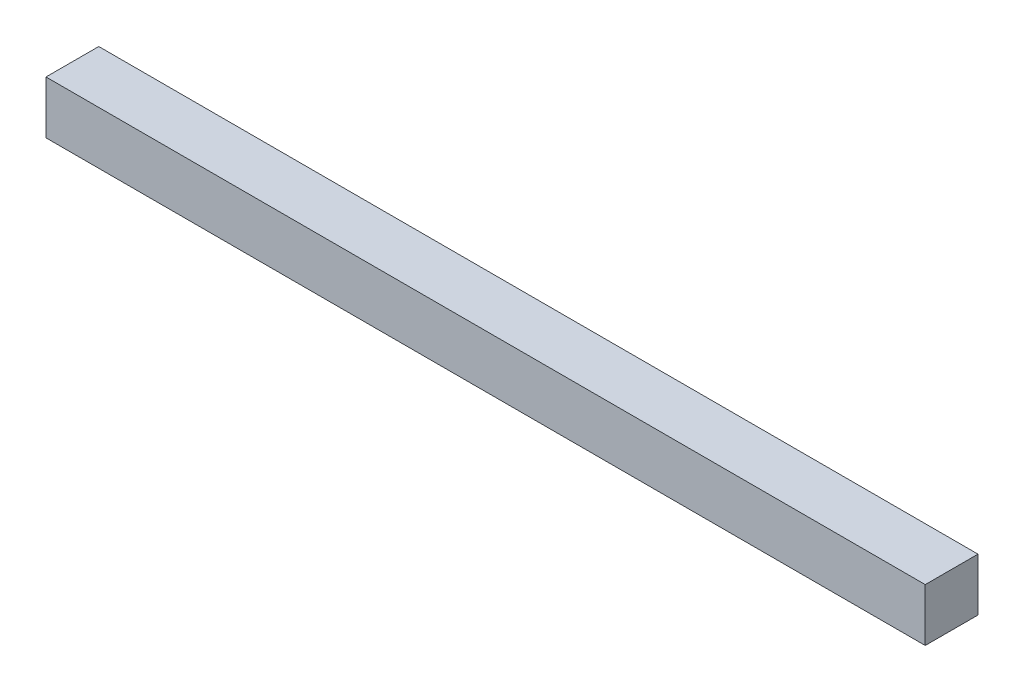
ISO-10303-21;
HEADER;
FILE_DESCRIPTION(('STEP AP214'),'2;1');
FILE_NAME('part.step','',(''),(''),'','','');
FILE_SCHEMA(('AUTOMOTIVE_DESIGN { 1 0 10303 214 1 1 1 1 }'));
ENDSEC;
DATA;
#1=APPLICATION_CONTEXT('core data for automotive mechanical design processes');
#2=APPLICATION_PROTOCOL_DEFINITION('international standard','automotive_design',2000,#1);
#3=PRODUCT_CONTEXT('',#1,'mechanical');
#4=PRODUCT('Part','Part','',(#3));
#5=PRODUCT_RELATED_PRODUCT_CATEGORY('part','',(#4));
#6=PRODUCT_DEFINITION_FORMATION('','',#4);
#7=PRODUCT_DEFINITION_CONTEXT('part definition',#1,'design');
#8=PRODUCT_DEFINITION('design','',#6,#7);
#9=PRODUCT_DEFINITION_SHAPE('','',#8);
#10=(LENGTH_UNIT() NAMED_UNIT(*) SI_UNIT(.MILLI.,.METRE.));
#11=(NAMED_UNIT(*) PLANE_ANGLE_UNIT() SI_UNIT($,.RADIAN.));
#12=(NAMED_UNIT(*) SI_UNIT($,.STERADIAN.) SOLID_ANGLE_UNIT());
#13=UNCERTAINTY_MEASURE_WITH_UNIT(LENGTH_MEASURE(1.E-05),#10,'distance_accuracy_value','');
#14=(GEOMETRIC_REPRESENTATION_CONTEXT(3) GLOBAL_UNCERTAINTY_ASSIGNED_CONTEXT((#13)) GLOBAL_UNIT_ASSIGNED_CONTEXT((#10,
#11,#12)) REPRESENTATION_CONTEXT('',''));
#15=CARTESIAN_POINT('',(0.,0.,0.));
#16=DIRECTION('',(0.,0.,1.));
#17=DIRECTION('',(1.,0.,0.));
#18=AXIS2_PLACEMENT_3D('',#15,#16,#17);
#19=CARTESIAN_POINT('',(500.,21.9634752981268,-20.3959114139693));
#20=DIRECTION('',(0.,0.,1.));
#21=DIRECTION('',(0.,-1.,0.));
#22=AXIS2_PLACEMENT_3D('',#19,#20,#21);
#23=PLANE('',#22);
#24=DIRECTION('',(0.,1.,0.));
#25=VECTOR('',#24,1.);
#26=CARTESIAN_POINT('',(0.,21.9634752981268,-20.3959114139693));
#27=LINE('',#26,#25);
#28=CARTESIAN_POINT('',(0.,-8.03652470187323,-20.3959114139693));
#29=VERTEX_POINT('',#28);
#30=CARTESIAN_POINT('',(0.,21.9634752981268,-20.3959114139693));
#31=VERTEX_POINT('',#30);
#32=EDGE_CURVE('E95',#29,#31,#27,.T.);
#33=ORIENTED_EDGE('',*,*,#32,.T.);
#34=DIRECTION('',(-1.,0.,0.));
#35=VECTOR('',#34,1.);
#36=CARTESIAN_POINT('',(500.,21.9634752981268,-20.3959114139693));
#37=LINE('',#36,#35);
#38=CARTESIAN_POINT('',(500.,21.9634752981268,-20.3959114139693));
#39=VERTEX_POINT('',#38);
#40=EDGE_CURVE('E11',#39,#31,#37,.T.);
#41=ORIENTED_EDGE('',*,*,#40,.F.);
#42=DIRECTION('',(0.,1.,0.));
#43=VECTOR('',#42,1.);
#44=CARTESIAN_POINT('',(500.,21.9634752981268,-20.3959114139693));
#45=LINE('',#44,#43);
#46=CARTESIAN_POINT('',(500.,-8.03652470187323,-20.3959114139693));
#47=VERTEX_POINT('',#46);
#48=EDGE_CURVE('E83',#47,#39,#45,.T.);
#49=ORIENTED_EDGE('',*,*,#48,.F.);
#50=DIRECTION('',(-1.,0.,0.));
#51=VECTOR('',#50,1.);
#52=CARTESIAN_POINT('',(500.,-8.03652470187323,-20.3959114139693));
#53=LINE('',#52,#51);
#54=EDGE_CURVE('E91',#47,#29,#53,.T.);
#55=ORIENTED_EDGE('',*,*,#54,.T.);
#56=EDGE_LOOP('',(#33,#41,#49,#55));
#57=FACE_BOUND('',#56,.T.);
#58=ADVANCED_FACE('F32',(#57),#23,.F.);
#59=CARTESIAN_POINT('',(500.,21.9634752981268,-20.3959114139693));
#60=DIRECTION('',(0.,-1.,0.));
#61=DIRECTION('',(0.,0.,-1.));
#62=AXIS2_PLACEMENT_3D('',#59,#60,#61);
#63=PLANE('',#62);
#64=DIRECTION('',(0.,0.,1.));
#65=VECTOR('',#64,1.);
#66=CARTESIAN_POINT('',(0.,21.9634752981268,-20.3959114139693));
#67=LINE('',#66,#65);
#68=CARTESIAN_POINT('',(0.,21.9634752981268,9.60408858603067));
#69=VERTEX_POINT('',#68);
#70=EDGE_CURVE('E87',#31,#69,#67,.T.);
#71=ORIENTED_EDGE('',*,*,#70,.T.);
#72=DIRECTION('',(-1.,0.,0.));
#73=VECTOR('',#72,1.);
#74=CARTESIAN_POINT('',(500.,21.9634752981268,9.60408858603067));
#75=LINE('',#74,#73);
#76=CARTESIAN_POINT('',(500.,21.9634752981268,9.60408858603067));
#77=VERTEX_POINT('',#76);
#78=EDGE_CURVE('E40',#77,#69,#75,.T.);
#79=ORIENTED_EDGE('',*,*,#78,.F.);
#80=DIRECTION('',(0.,0.,1.));
#81=VECTOR('',#80,1.);
#82=CARTESIAN_POINT('',(500.,21.9634752981268,-20.3959114139693));
#83=LINE('',#82,#81);
#84=EDGE_CURVE('E78',#39,#77,#83,.T.);
#85=ORIENTED_EDGE('',*,*,#84,.F.);
#86=ORIENTED_EDGE('',*,*,#40,.T.);
#87=EDGE_LOOP('',(#71,#79,#85,#86));
#88=FACE_BOUND('',#87,.T.);
#89=ADVANCED_FACE('F86',(#88),#63,.F.);
#90=CARTESIAN_POINT('',(500.,21.9634752981268,9.60408858603067));
#91=DIRECTION('',(0.,0.,-1.));
#92=DIRECTION('',(0.,1.,0.));
#93=AXIS2_PLACEMENT_3D('',#90,#91,#92);
#94=PLANE('',#93);
#95=DIRECTION('',(0.,-1.,0.));
#96=VECTOR('',#95,1.);
#97=CARTESIAN_POINT('',(0.,21.9634752981268,9.60408858603067));
#98=LINE('',#97,#96);
#99=CARTESIAN_POINT('',(0.,-8.03652470187323,9.60408858603066));
#100=VERTEX_POINT('',#99);
#101=EDGE_CURVE('E65',#69,#100,#98,.T.);
#102=ORIENTED_EDGE('',*,*,#101,.T.);
#103=DIRECTION('',(-1.,0.,0.));
#104=VECTOR('',#103,1.);
#105=CARTESIAN_POINT('',(500.,-8.03652470187323,9.60408858603066));
#106=LINE('',#105,#104);
#107=CARTESIAN_POINT('',(500.,-8.03652470187323,9.60408858603066));
#108=VERTEX_POINT('',#107);
#109=EDGE_CURVE('E88',#108,#100,#106,.T.);
#110=ORIENTED_EDGE('',*,*,#109,.F.);
#111=DIRECTION('',(0.,-1.,0.));
#112=VECTOR('',#111,1.);
#113=CARTESIAN_POINT('',(500.,21.9634752981268,9.60408858603067));
#114=LINE('',#113,#112);
#115=EDGE_CURVE('E81',#77,#108,#114,.T.);
#116=ORIENTED_EDGE('',*,*,#115,.F.);
#117=ORIENTED_EDGE('',*,*,#78,.T.);
#118=EDGE_LOOP('',(#102,#110,#116,#117));
#119=FACE_BOUND('',#118,.T.);
#120=ADVANCED_FACE('F89',(#119),#94,.F.);
#121=CARTESIAN_POINT('',(500.,-8.03652470187323,-20.3959114139693));
#122=DIRECTION('',(0.,1.,0.));
#123=DIRECTION('',(0.,0.,1.));
#124=AXIS2_PLACEMENT_3D('',#121,#122,#123);
#125=PLANE('',#124);
#126=DIRECTION('',(0.,0.,-1.));
#127=VECTOR('',#126,1.);
#128=CARTESIAN_POINT('',(0.,-8.03652470187323,-20.3959114139693));
#129=LINE('',#128,#127);
#130=EDGE_CURVE('E71',#100,#29,#129,.T.);
#131=ORIENTED_EDGE('',*,*,#130,.T.);
#132=ORIENTED_EDGE('',*,*,#54,.F.);
#133=DIRECTION('',(0.,0.,-1.));
#134=VECTOR('',#133,1.);
#135=CARTESIAN_POINT('',(500.,-8.03652470187323,-20.3959114139693));
#136=LINE('',#135,#134);
#137=EDGE_CURVE('E48',#108,#47,#136,.T.);
#138=ORIENTED_EDGE('',*,*,#137,.F.);
#139=ORIENTED_EDGE('',*,*,#109,.T.);
#140=EDGE_LOOP('',(#131,#132,#138,#139));
#141=FACE_BOUND('',#140,.T.);
#142=ADVANCED_FACE('F102',(#141),#125,.F.);
#143=CARTESIAN_POINT('',(500.,0.,0.));
#144=DIRECTION('',(-1.,0.,0.));
#145=DIRECTION('',(0.,0.,1.));
#146=AXIS2_PLACEMENT_3D('',#143,#144,#145);
#147=PLANE('',#146);
#148=ORIENTED_EDGE('',*,*,#48,.T.);
#149=ORIENTED_EDGE('',*,*,#84,.T.);
#150=ORIENTED_EDGE('',*,*,#115,.T.);
#151=ORIENTED_EDGE('',*,*,#137,.T.);
#152=EDGE_LOOP('',(#148,#149,#150,#151));
#153=FACE_BOUND('',#152,.T.);
#154=ADVANCED_FACE('F79',(#153),#147,.F.);
#155=CARTESIAN_POINT('',(0.,0.,0.));
#156=DIRECTION('',(-1.,0.,0.));
#157=DIRECTION('',(0.,0.,1.));
#158=AXIS2_PLACEMENT_3D('',#155,#156,#157);
#159=PLANE('',#158);
#160=ORIENTED_EDGE('',*,*,#32,.F.);
#161=ORIENTED_EDGE('',*,*,#130,.F.);
#162=ORIENTED_EDGE('',*,*,#101,.F.);
#163=ORIENTED_EDGE('',*,*,#70,.F.);
#164=EDGE_LOOP('',(#160,#161,#162,#163));
#165=FACE_BOUND('',#164,.T.);
#166=ADVANCED_FACE('F105',(#165),#159,.T.);
#167=CLOSED_SHELL('',(#58,#89,#120,#142,#154,#166));
#168=MANIFOLD_SOLID_BREP('B2',#167);
#169=ADVANCED_BREP_SHAPE_REPRESENTATION('',(#18,#168),#14);
#170=SHAPE_DEFINITION_REPRESENTATION(#9,#169);
ENDSEC;
END-ISO-10303-21;
